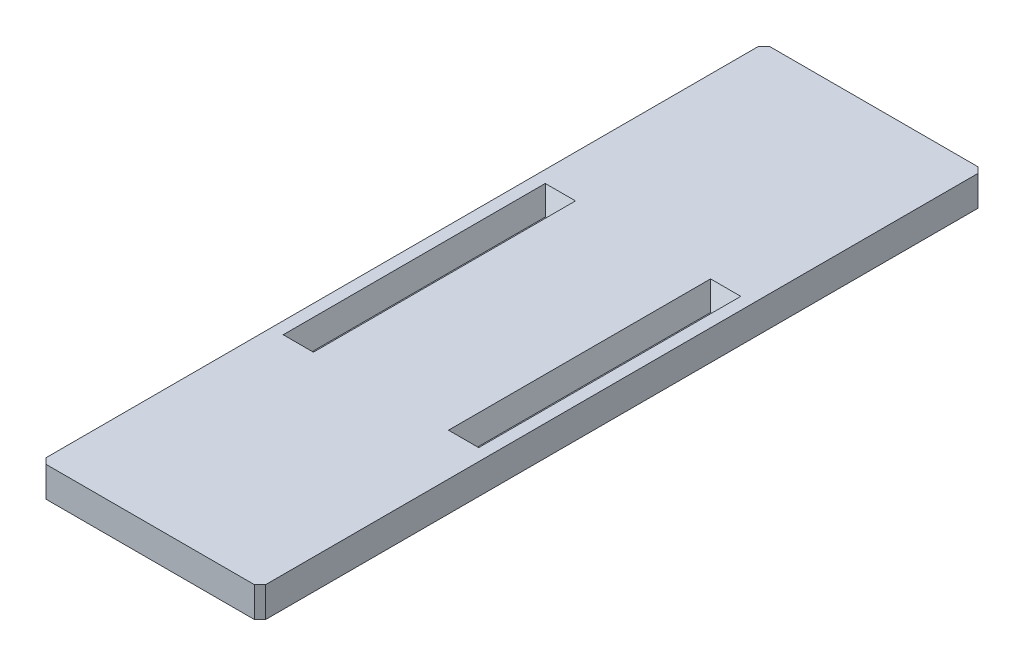
ISO-10303-21;
HEADER;
FILE_DESCRIPTION(('STEP AP214'),'2;1');
FILE_NAME('part.step','',(''),(''),'','','');
FILE_SCHEMA(('AUTOMOTIVE_DESIGN { 1 0 10303 214 1 1 1 1 }'));
ENDSEC;
DATA;
#1=APPLICATION_CONTEXT('core data for automotive mechanical design processes');
#2=APPLICATION_PROTOCOL_DEFINITION('international standard','automotive_design',2000,#1);
#3=PRODUCT_CONTEXT('',#1,'mechanical');
#4=PRODUCT('Part','Part','',(#3));
#5=PRODUCT_RELATED_PRODUCT_CATEGORY('part','',(#4));
#6=PRODUCT_DEFINITION_FORMATION('','',#4);
#7=PRODUCT_DEFINITION_CONTEXT('part definition',#1,'design');
#8=PRODUCT_DEFINITION('design','',#6,#7);
#9=PRODUCT_DEFINITION_SHAPE('','',#8);
#10=(LENGTH_UNIT() NAMED_UNIT(*) SI_UNIT(.MILLI.,.METRE.));
#11=(NAMED_UNIT(*) PLANE_ANGLE_UNIT() SI_UNIT($,.RADIAN.));
#12=(NAMED_UNIT(*) SI_UNIT($,.STERADIAN.) SOLID_ANGLE_UNIT());
#13=UNCERTAINTY_MEASURE_WITH_UNIT(LENGTH_MEASURE(1.E-05),#10,'distance_accuracy_value','');
#14=(GEOMETRIC_REPRESENTATION_CONTEXT(3) GLOBAL_UNCERTAINTY_ASSIGNED_CONTEXT((#13)) GLOBAL_UNIT_ASSIGNED_CONTEXT((#10,
#11,#12)) REPRESENTATION_CONTEXT('',''));
#15=CARTESIAN_POINT('',(0.,0.,0.));
#16=DIRECTION('',(0.,0.,1.));
#17=DIRECTION('',(1.,0.,0.));
#18=AXIS2_PLACEMENT_3D('',#15,#16,#17);
#19=CARTESIAN_POINT('',(0.,1.5,0.));
#20=DIRECTION('',(0.,1.,0.));
#21=DIRECTION('',(0.,0.,1.));
#22=AXIS2_PLACEMENT_3D('',#19,#20,#21);
#23=PLANE('',#22);
#24=DIRECTION('',(0.,0.,-1.));
#25=VECTOR('',#24,1.);
#26=CARTESIAN_POINT('',(10.5,1.5,11.65));
#27=LINE('',#26,#25);
#28=CARTESIAN_POINT('',(10.5,1.5,24.65));
#29=VERTEX_POINT('',#28);
#30=CARTESIAN_POINT('',(10.5,1.5,11.65));
#31=VERTEX_POINT('',#30);
#32=EDGE_CURVE('E187',#29,#31,#27,.T.);
#33=ORIENTED_EDGE('',*,*,#32,.F.);
#34=DIRECTION('',(1.,0.,0.));
#35=VECTOR('',#34,1.);
#36=CARTESIAN_POINT('',(10.5,1.5,24.65));
#37=LINE('',#36,#35);
#38=CARTESIAN_POINT('',(9.00000000000001,1.5,24.65));
#39=VERTEX_POINT('',#38);
#40=EDGE_CURVE('E238',#39,#29,#37,.T.);
#41=ORIENTED_EDGE('',*,*,#40,.F.);
#42=DIRECTION('',(0.,0.,1.));
#43=VECTOR('',#42,1.);
#44=CARTESIAN_POINT('',(9.00000000000001,1.5,11.65));
#45=LINE('',#44,#43);
#46=CARTESIAN_POINT('',(9.00000000000001,1.5,11.65));
#47=VERTEX_POINT('',#46);
#48=EDGE_CURVE('E235',#47,#39,#45,.T.);
#49=ORIENTED_EDGE('',*,*,#48,.F.);
#50=DIRECTION('',(-1.,0.,0.));
#51=VECTOR('',#50,1.);
#52=CARTESIAN_POINT('',(10.5,1.5,11.65));
#53=LINE('',#52,#51);
#54=EDGE_CURVE('E232',#31,#47,#53,.T.);
#55=ORIENTED_EDGE('',*,*,#54,.F.);
#56=EDGE_LOOP('',(#33,#41,#49,#55));
#57=FACE_BOUND('',#56,.T.);
#58=DIRECTION('',(0.,0.,1.));
#59=VECTOR('',#58,1.);
#60=CARTESIAN_POINT('',(0.800000000000003,1.5,11.65));
#61=LINE('',#60,#59);
#62=CARTESIAN_POINT('',(0.800000000000003,1.5,11.65));
#63=VERTEX_POINT('',#62);
#64=CARTESIAN_POINT('',(0.800000000000003,1.5,24.65));
#65=VERTEX_POINT('',#64);
#66=EDGE_CURVE('E197',#63,#65,#61,.T.);
#67=ORIENTED_EDGE('',*,*,#66,.F.);
#68=DIRECTION('',(-1.,0.,0.));
#69=VECTOR('',#68,1.);
#70=CARTESIAN_POINT('',(0.800000000000003,1.5,11.65));
#71=LINE('',#70,#69);
#72=CARTESIAN_POINT('',(2.3,1.5,11.65));
#73=VERTEX_POINT('',#72);
#74=EDGE_CURVE('E206',#73,#63,#71,.T.);
#75=ORIENTED_EDGE('',*,*,#74,.F.);
#76=DIRECTION('',(0.,0.,-1.));
#77=VECTOR('',#76,1.);
#78=CARTESIAN_POINT('',(2.3,1.5,11.65));
#79=LINE('',#78,#77);
#80=CARTESIAN_POINT('',(2.3,1.5,24.65));
#81=VERTEX_POINT('',#80);
#82=EDGE_CURVE('E203',#81,#73,#79,.T.);
#83=ORIENTED_EDGE('',*,*,#82,.F.);
#84=DIRECTION('',(1.,0.,0.));
#85=VECTOR('',#84,1.);
#86=CARTESIAN_POINT('',(0.800000000000003,1.5,24.65));
#87=LINE('',#86,#85);
#88=EDGE_CURVE('E199',#65,#81,#87,.T.);
#89=ORIENTED_EDGE('',*,*,#88,.F.);
#90=EDGE_LOOP('',(#67,#75,#83,#89));
#91=FACE_BOUND('',#90,.T.);
#92=DIRECTION('',(-1.,0.,0.));
#93=VECTOR('',#92,1.);
#94=CARTESIAN_POINT('',(10.8171572875254,1.5,0.2));
#95=LINE('',#94,#93);
#96=CARTESIAN_POINT('',(10.8171572875254,1.5,0.2));
#97=VERTEX_POINT('',#96);
#98=CARTESIAN_POINT('',(0.48284271247462,1.5,0.2));
#99=VERTEX_POINT('',#98);
#100=EDGE_CURVE('E183',#97,#99,#95,.T.);
#101=ORIENTED_EDGE('',*,*,#100,.T.);
#102=DIRECTION('',(-0.707106781186548,0.,0.707106781186548));
#103=VECTOR('',#102,1.);
#104=CARTESIAN_POINT('',(0.48284271247462,1.5,0.2));
#105=LINE('',#104,#103);
#106=CARTESIAN_POINT('',(0.2,1.5,0.48284271247462));
#107=VERTEX_POINT('',#106);
#108=EDGE_CURVE('E172',#99,#107,#105,.T.);
#109=ORIENTED_EDGE('',*,*,#108,.T.);
#110=DIRECTION('',(0.,0.,1.));
#111=VECTOR('',#110,1.);
#112=CARTESIAN_POINT('',(0.2,1.5,0.48284271247462));
#113=LINE('',#112,#111);
#114=CARTESIAN_POINT('',(0.2,1.5,35.8171572875254));
#115=VERTEX_POINT('',#114);
#116=EDGE_CURVE('E170',#107,#115,#113,.T.);
#117=ORIENTED_EDGE('',*,*,#116,.T.);
#118=DIRECTION('',(0.707106781186547,0.,0.707106781186548));
#119=VECTOR('',#118,1.);
#120=CARTESIAN_POINT('',(0.2,1.5,35.8171572875254));
#121=LINE('',#120,#119);
#122=CARTESIAN_POINT('',(0.482842712474612,1.5,36.1));
#123=VERTEX_POINT('',#122);
#124=EDGE_CURVE('E52',#115,#123,#121,.T.);
#125=ORIENTED_EDGE('',*,*,#124,.T.);
#126=DIRECTION('',(1.,0.,0.));
#127=VECTOR('',#126,1.);
#128=CARTESIAN_POINT('',(0.482842712474612,1.5,36.1));
#129=LINE('',#128,#127);
#130=CARTESIAN_POINT('',(10.8171572875254,1.5,36.1));
#131=VERTEX_POINT('',#130);
#132=EDGE_CURVE('E159',#123,#131,#129,.T.);
#133=ORIENTED_EDGE('',*,*,#132,.T.);
#134=DIRECTION('',(0.707106781186545,0.,-0.70710678118655));
#135=VECTOR('',#134,1.);
#136=CARTESIAN_POINT('',(10.8171572875254,1.5,36.1));
#137=LINE('',#136,#135);
#138=CARTESIAN_POINT('',(11.1,1.5,35.8171572875254));
#139=VERTEX_POINT('',#138);
#140=EDGE_CURVE('E165',#131,#139,#137,.T.);
#141=ORIENTED_EDGE('',*,*,#140,.T.);
#142=DIRECTION('',(0.,0.,-1.));
#143=VECTOR('',#142,1.);
#144=CARTESIAN_POINT('',(11.1,1.5,35.8171572875254));
#145=LINE('',#144,#143);
#146=CARTESIAN_POINT('',(11.1,1.5,0.482842712474624));
#147=VERTEX_POINT('',#146);
#148=EDGE_CURVE('E177',#139,#147,#145,.T.);
#149=ORIENTED_EDGE('',*,*,#148,.T.);
#150=DIRECTION('',(-0.707106781186544,0.,-0.707106781186551));
#151=VECTOR('',#150,1.);
#152=CARTESIAN_POINT('',(11.1,1.5,0.482842712474624));
#153=LINE('',#152,#151);
#154=EDGE_CURVE('E180',#147,#97,#153,.T.);
#155=ORIENTED_EDGE('',*,*,#154,.T.);
#156=EDGE_LOOP('',(#101,#109,#117,#125,#133,#141,#149,#155));
#157=FACE_BOUND('',#156,.T.);
#158=ADVANCED_FACE('F37',(#57,#91,#157),#23,.T.);
#159=CARTESIAN_POINT('',(10.5,1.5,11.65));
#160=DIRECTION('',(0.913545457642601,-0.4067366430758,0.));
#161=DIRECTION('',(0.4067366430758,0.913545457642601,0.));
#162=AXIS2_PLACEMENT_3D('',#159,#160,#161);
#163=PLANE('',#162);
#164=ORIENTED_EDGE('',*,*,#32,.T.);
#165=DIRECTION('',(0.376763938507217,0.846225660968196,-0.376763938507217));
#166=VECTOR('',#165,1.);
#167=CARTESIAN_POINT('',(10.5,1.5,11.65));
#168=LINE('',#167,#166);
#169=CARTESIAN_POINT('',(10.0547713146915,0.5,12.0952286853085));
#170=VERTEX_POINT('',#169);
#171=EDGE_CURVE('E244',#170,#31,#168,.T.);
#172=ORIENTED_EDGE('',*,*,#171,.F.);
#173=DIRECTION('',(0.,0.,-1.));
#174=VECTOR('',#173,1.);
#175=CARTESIAN_POINT('',(10.0547713146915,0.5,11.65));
#176=LINE('',#175,#174);
#177=CARTESIAN_POINT('',(10.0547713146915,0.5,24.2047713146915));
#178=VERTEX_POINT('',#177);
#179=EDGE_CURVE('E241',#178,#170,#176,.T.);
#180=ORIENTED_EDGE('',*,*,#179,.F.);
#181=DIRECTION('',(0.376763938507217,0.846225660968196,0.376763938507217));
#182=VECTOR('',#181,1.);
#183=CARTESIAN_POINT('',(10.5,1.5,24.65));
#184=LINE('',#183,#182);
#185=EDGE_CURVE('E200',#178,#29,#184,.T.);
#186=ORIENTED_EDGE('',*,*,#185,.T.);
#187=EDGE_LOOP('',(#164,#172,#180,#186));
#188=FACE_BOUND('',#187,.T.);
#189=ADVANCED_FACE('F305',(#188),#163,.F.);
#190=CARTESIAN_POINT('',(10.5,1.5,24.65));
#191=DIRECTION('',(0.,-0.4067366430758,0.913545457642601));
#192=DIRECTION('',(0.,-0.913545457642601,-0.4067366430758));
#193=AXIS2_PLACEMENT_3D('',#190,#191,#192);
#194=PLANE('',#193);
#195=ORIENTED_EDGE('',*,*,#40,.T.);
#196=ORIENTED_EDGE('',*,*,#185,.F.);
#197=DIRECTION('',(1.,0.,0.));
#198=VECTOR('',#197,1.);
#199=CARTESIAN_POINT('',(10.5,0.5,24.2047713146915));
#200=LINE('',#199,#198);
#201=CARTESIAN_POINT('',(9.44522868530854,0.5,24.2047713146915));
#202=VERTEX_POINT('',#201);
#203=EDGE_CURVE('E248',#202,#178,#200,.T.);
#204=ORIENTED_EDGE('',*,*,#203,.F.);
#205=DIRECTION('',(-0.376763938507217,0.846225660968196,0.376763938507217));
#206=VECTOR('',#205,1.);
#207=CARTESIAN_POINT('',(10.8453638496731,-2.64475506759926,22.8046361503269));
#208=LINE('',#207,#206);
#209=EDGE_CURVE('E243',#202,#39,#208,.T.);
#210=ORIENTED_EDGE('',*,*,#209,.T.);
#211=EDGE_LOOP('',(#195,#196,#204,#210));
#212=FACE_BOUND('',#211,.T.);
#213=ADVANCED_FACE('F310',(#212),#194,.F.);
#214=CARTESIAN_POINT('',(9.00000000000001,1.5,11.65));
#215=DIRECTION('',(-0.913545457642601,-0.4067366430758,0.));
#216=DIRECTION('',(0.4067366430758,-0.913545457642601,0.));
#217=AXIS2_PLACEMENT_3D('',#214,#215,#216);
#218=PLANE('',#217);
#219=ORIENTED_EDGE('',*,*,#48,.T.);
#220=ORIENTED_EDGE('',*,*,#209,.F.);
#221=DIRECTION('',(0.,0.,1.));
#222=VECTOR('',#221,1.);
#223=CARTESIAN_POINT('',(9.44522868530854,0.5,11.65));
#224=LINE('',#223,#222);
#225=CARTESIAN_POINT('',(9.44522868530854,0.5,12.0952286853085));
#226=VERTEX_POINT('',#225);
#227=EDGE_CURVE('E256',#226,#202,#224,.T.);
#228=ORIENTED_EDGE('',*,*,#227,.F.);
#229=DIRECTION('',(-0.376763938507217,0.846225660968196,-0.376763938507217));
#230=VECTOR('',#229,1.);
#231=CARTESIAN_POINT('',(9.21292659803921,1.02175903066162,11.8629265980392));
#232=LINE('',#231,#230);
#233=EDGE_CURVE('E247',#226,#47,#232,.T.);
#234=ORIENTED_EDGE('',*,*,#233,.T.);
#235=EDGE_LOOP('',(#219,#220,#228,#234));
#236=FACE_BOUND('',#235,.T.);
#237=ADVANCED_FACE('F318',(#236),#218,.F.);
#238=CARTESIAN_POINT('',(10.5,1.5,11.65));
#239=DIRECTION('',(0.,-0.4067366430758,-0.913545457642601));
#240=DIRECTION('',(0.,0.913545457642601,-0.4067366430758));
#241=AXIS2_PLACEMENT_3D('',#238,#239,#240);
#242=PLANE('',#241);
#243=ORIENTED_EDGE('',*,*,#54,.T.);
#244=ORIENTED_EDGE('',*,*,#233,.F.);
#245=DIRECTION('',(-1.,0.,0.));
#246=VECTOR('',#245,1.);
#247=CARTESIAN_POINT('',(10.5,0.5,12.0952286853085));
#248=LINE('',#247,#246);
#249=EDGE_CURVE('E253',#170,#226,#248,.T.);
#250=ORIENTED_EDGE('',*,*,#249,.F.);
#251=ORIENTED_EDGE('',*,*,#171,.T.);
#252=EDGE_LOOP('',(#243,#244,#250,#251));
#253=FACE_BOUND('',#252,.T.);
#254=ADVANCED_FACE('F322',(#253),#242,.F.);
#255=CARTESIAN_POINT('',(0.,0.5,0.));
#256=DIRECTION('',(0.,-1.,0.));
#257=DIRECTION('',(0.,0.,-1.));
#258=AXIS2_PLACEMENT_3D('',#255,#256,#257);
#259=PLANE('',#258);
#260=ORIENTED_EDGE('',*,*,#179,.T.);
#261=ORIENTED_EDGE('',*,*,#249,.T.);
#262=ORIENTED_EDGE('',*,*,#227,.T.);
#263=ORIENTED_EDGE('',*,*,#203,.T.);
#264=EDGE_LOOP('',(#260,#261,#262,#263));
#265=FACE_BOUND('',#264,.T.);
#266=ADVANCED_FACE('F325',(#265),#259,.F.);
#267=CARTESIAN_POINT('',(0.800000000000003,1.5,11.65));
#268=DIRECTION('',(-0.913545457642601,-0.4067366430758,0.));
#269=DIRECTION('',(0.4067366430758,-0.913545457642601,0.));
#270=AXIS2_PLACEMENT_3D('',#267,#268,#269);
#271=PLANE('',#270);
#272=ORIENTED_EDGE('',*,*,#66,.T.);
#273=DIRECTION('',(-0.376763938507217,0.846225660968196,0.376763938507217));
#274=VECTOR('',#273,1.);
#275=CARTESIAN_POINT('',(2.64536384967311,-2.64475506759926,22.8046361503269));
#276=LINE('',#275,#274);
#277=CARTESIAN_POINT('',(1.24522868530854,0.5,24.2047713146915));
#278=VERTEX_POINT('',#277);
#279=EDGE_CURVE('E214',#278,#65,#276,.T.);
#280=ORIENTED_EDGE('',*,*,#279,.F.);
#281=DIRECTION('',(0.,0.,1.));
#282=VECTOR('',#281,1.);
#283=CARTESIAN_POINT('',(1.24522868530854,0.5,0.));
#284=LINE('',#283,#282);
#285=CARTESIAN_POINT('',(1.24522868530854,0.5,12.0952286853085));
#286=VERTEX_POINT('',#285);
#287=EDGE_CURVE('E209',#286,#278,#284,.T.);
#288=ORIENTED_EDGE('',*,*,#287,.F.);
#289=DIRECTION('',(-0.376763938507217,0.846225660968196,-0.376763938507217));
#290=VECTOR('',#289,1.);
#291=CARTESIAN_POINT('',(0.800000000000003,1.5,11.65));
#292=LINE('',#291,#290);
#293=EDGE_CURVE('E210',#286,#63,#292,.T.);
#294=ORIENTED_EDGE('',*,*,#293,.T.);
#295=EDGE_LOOP('',(#272,#280,#288,#294));
#296=FACE_BOUND('',#295,.T.);
#297=ADVANCED_FACE('F330',(#296),#271,.F.);
#298=CARTESIAN_POINT('',(0.800000000000003,1.5,11.65));
#299=DIRECTION('',(0.,-0.4067366430758,-0.913545457642601));
#300=DIRECTION('',(0.,0.913545457642601,-0.4067366430758));
#301=AXIS2_PLACEMENT_3D('',#298,#299,#300);
#302=PLANE('',#301);
#303=ORIENTED_EDGE('',*,*,#74,.T.);
#304=ORIENTED_EDGE('',*,*,#293,.F.);
#305=DIRECTION('',(-1.,0.,0.));
#306=VECTOR('',#305,1.);
#307=CARTESIAN_POINT('',(0.,0.5,12.0952286853085));
#308=LINE('',#307,#306);
#309=CARTESIAN_POINT('',(1.85477131469147,0.5,12.0952286853085));
#310=VERTEX_POINT('',#309);
#311=EDGE_CURVE('E218',#310,#286,#308,.T.);
#312=ORIENTED_EDGE('',*,*,#311,.F.);
#313=DIRECTION('',(0.376763938507217,0.846225660968196,-0.376763938507217));
#314=VECTOR('',#313,1.);
#315=CARTESIAN_POINT('',(2.3,1.5,11.65));
#316=LINE('',#315,#314);
#317=EDGE_CURVE('E213',#310,#73,#316,.T.);
#318=ORIENTED_EDGE('',*,*,#317,.T.);
#319=EDGE_LOOP('',(#303,#304,#312,#318));
#320=FACE_BOUND('',#319,.T.);
#321=ADVANCED_FACE('F332',(#320),#302,.F.);
#322=CARTESIAN_POINT('',(2.3,1.5,11.65));
#323=DIRECTION('',(0.913545457642601,-0.4067366430758,0.));
#324=DIRECTION('',(0.4067366430758,0.913545457642601,0.));
#325=AXIS2_PLACEMENT_3D('',#322,#323,#324);
#326=PLANE('',#325);
#327=ORIENTED_EDGE('',*,*,#82,.T.);
#328=ORIENTED_EDGE('',*,*,#317,.F.);
#329=DIRECTION('',(0.,0.,-1.));
#330=VECTOR('',#329,1.);
#331=CARTESIAN_POINT('',(1.85477131469147,0.5,0.));
#332=LINE('',#331,#330);
#333=CARTESIAN_POINT('',(1.85477131469147,0.5,24.2047713146915));
#334=VERTEX_POINT('',#333);
#335=EDGE_CURVE('E226',#334,#310,#332,.T.);
#336=ORIENTED_EDGE('',*,*,#335,.F.);
#337=DIRECTION('',(0.376763938507217,0.846225660968196,0.376763938507217));
#338=VECTOR('',#337,1.);
#339=CARTESIAN_POINT('',(2.0870734019608,1.02175903066162,24.4370734019608));
#340=LINE('',#339,#338);
#341=EDGE_CURVE('E217',#334,#81,#340,.T.);
#342=ORIENTED_EDGE('',*,*,#341,.T.);
#343=EDGE_LOOP('',(#327,#328,#336,#342));
#344=FACE_BOUND('',#343,.T.);
#345=ADVANCED_FACE('F335',(#344),#326,.F.);
#346=CARTESIAN_POINT('',(0.800000000000003,1.5,24.65));
#347=DIRECTION('',(0.,-0.4067366430758,0.913545457642601));
#348=DIRECTION('',(0.,-0.913545457642601,-0.4067366430758));
#349=AXIS2_PLACEMENT_3D('',#346,#347,#348);
#350=PLANE('',#349);
#351=ORIENTED_EDGE('',*,*,#88,.T.);
#352=ORIENTED_EDGE('',*,*,#341,.F.);
#353=DIRECTION('',(1.,0.,0.));
#354=VECTOR('',#353,1.);
#355=CARTESIAN_POINT('',(0.,0.5,24.2047713146915));
#356=LINE('',#355,#354);
#357=EDGE_CURVE('E223',#278,#334,#356,.T.);
#358=ORIENTED_EDGE('',*,*,#357,.F.);
#359=ORIENTED_EDGE('',*,*,#279,.T.);
#360=EDGE_LOOP('',(#351,#352,#358,#359));
#361=FACE_BOUND('',#360,.T.);
#362=ADVANCED_FACE('F339',(#361),#350,.F.);
#363=CARTESIAN_POINT('',(0.,0.5,0.));
#364=DIRECTION('',(0.,1.,0.));
#365=DIRECTION('',(0.,0.,1.));
#366=AXIS2_PLACEMENT_3D('',#363,#364,#365);
#367=PLANE('',#366);
#368=ORIENTED_EDGE('',*,*,#287,.T.);
#369=ORIENTED_EDGE('',*,*,#357,.T.);
#370=ORIENTED_EDGE('',*,*,#335,.T.);
#371=ORIENTED_EDGE('',*,*,#311,.T.);
#372=EDGE_LOOP('',(#368,#369,#370,#371));
#373=FACE_BOUND('',#372,.T.);
#374=ADVANCED_FACE('F343',(#373),#367,.T.);
#375=CARTESIAN_POINT('',(0.48284271247462,-8.5,0.2));
#376=DIRECTION('',(-0.707106781186548,0.,-0.707106781186548));
#377=DIRECTION('',(-0.707106781186548,0.,0.707106781186548));
#378=AXIS2_PLACEMENT_3D('',#375,#376,#377);
#379=PLANE('',#378);
#380=DIRECTION('',(-0.707106781186548,0.,0.707106781186548));
#381=VECTOR('',#380,1.);
#382=CARTESIAN_POINT('',(0.34142135623731,0.,0.34142135623731));
#383=LINE('',#382,#381);
#384=CARTESIAN_POINT('',(0.48284271247462,0.,0.2));
#385=VERTEX_POINT('',#384);
#386=CARTESIAN_POINT('',(0.2,0.,0.48284271247462));
#387=VERTEX_POINT('',#386);
#388=EDGE_CURVE('E11',#385,#387,#383,.T.);
#389=ORIENTED_EDGE('',*,*,#388,.T.);
#390=DIRECTION('',(0.,1.,0.));
#391=VECTOR('',#390,1.);
#392=CARTESIAN_POINT('',(0.2,-8.5,0.48284271247462));
#393=LINE('',#392,#391);
#394=EDGE_CURVE('E60',#387,#107,#393,.T.);
#395=ORIENTED_EDGE('',*,*,#394,.T.);
#396=ORIENTED_EDGE('',*,*,#108,.F.);
#397=DIRECTION('',(0.,1.,0.));
#398=VECTOR('',#397,1.);
#399=CARTESIAN_POINT('',(0.48284271247462,-8.5,0.2));
#400=LINE('',#399,#398);
#401=EDGE_CURVE('E185',#385,#99,#400,.T.);
#402=ORIENTED_EDGE('',*,*,#401,.F.);
#403=EDGE_LOOP('',(#389,#395,#396,#402));
#404=FACE_BOUND('',#403,.T.);
#405=ADVANCED_FACE('F281',(#404),#379,.T.);
#406=CARTESIAN_POINT('',(10.8171572875254,-8.5,0.2));
#407=DIRECTION('',(0.,0.,-1.));
#408=DIRECTION('',(-1.,0.,0.));
#409=AXIS2_PLACEMENT_3D('',#406,#407,#408);
#410=PLANE('',#409);
#411=DIRECTION('',(-1.,0.,0.));
#412=VECTOR('',#411,1.);
#413=CARTESIAN_POINT('',(0.,0.,0.2));
#414=LINE('',#413,#412);
#415=CARTESIAN_POINT('',(10.8171572875254,0.,0.2));
#416=VERTEX_POINT('',#415);
#417=EDGE_CURVE('E45',#416,#385,#414,.T.);
#418=ORIENTED_EDGE('',*,*,#417,.T.);
#419=ORIENTED_EDGE('',*,*,#401,.T.);
#420=ORIENTED_EDGE('',*,*,#100,.F.);
#421=DIRECTION('',(0.,1.,0.));
#422=VECTOR('',#421,1.);
#423=CARTESIAN_POINT('',(10.8171572875254,-8.5,0.2));
#424=LINE('',#423,#422);
#425=EDGE_CURVE('E188',#416,#97,#424,.T.);
#426=ORIENTED_EDGE('',*,*,#425,.F.);
#427=EDGE_LOOP('',(#418,#419,#420,#426));
#428=FACE_BOUND('',#427,.T.);
#429=ADVANCED_FACE('F274',(#428),#410,.T.);
#430=CARTESIAN_POINT('',(11.1,-8.5,0.482842712474624));
#431=DIRECTION('',(0.707106781186551,0.,-0.707106781186544));
#432=DIRECTION('',(-0.707106781186544,0.,-0.707106781186551));
#433=AXIS2_PLACEMENT_3D('',#430,#431,#432);
#434=PLANE('',#433);
#435=DIRECTION('',(-0.707106781186544,0.,-0.707106781186551));
#436=VECTOR('',#435,1.);
#437=CARTESIAN_POINT('',(5.30857864376274,0.,-5.30857864376269));
#438=LINE('',#437,#436);
#439=CARTESIAN_POINT('',(11.1,0.,0.482842712474624));
#440=VERTEX_POINT('',#439);
#441=EDGE_CURVE('E269',#440,#416,#438,.T.);
#442=ORIENTED_EDGE('',*,*,#441,.T.);
#443=ORIENTED_EDGE('',*,*,#425,.T.);
#444=ORIENTED_EDGE('',*,*,#154,.F.);
#445=DIRECTION('',(0.,1.,0.));
#446=VECTOR('',#445,1.);
#447=CARTESIAN_POINT('',(11.1,-8.5,0.482842712474624));
#448=LINE('',#447,#446);
#449=EDGE_CURVE('E190',#440,#147,#448,.T.);
#450=ORIENTED_EDGE('',*,*,#449,.F.);
#451=EDGE_LOOP('',(#442,#443,#444,#450));
#452=FACE_BOUND('',#451,.T.);
#453=ADVANCED_FACE('F288',(#452),#434,.T.);
#454=CARTESIAN_POINT('',(11.1,-8.5,35.8171572875254));
#455=DIRECTION('',(1.,0.,0.));
#456=DIRECTION('',(0.,0.,-1.));
#457=AXIS2_PLACEMENT_3D('',#454,#455,#456);
#458=PLANE('',#457);
#459=DIRECTION('',(0.,0.,-1.));
#460=VECTOR('',#459,1.);
#461=CARTESIAN_POINT('',(11.1,0.,0.));
#462=LINE('',#461,#460);
#463=CARTESIAN_POINT('',(11.1,0.,35.8171572875254));
#464=VERTEX_POINT('',#463);
#465=EDGE_CURVE('E267',#464,#440,#462,.T.);
#466=ORIENTED_EDGE('',*,*,#465,.T.);
#467=ORIENTED_EDGE('',*,*,#449,.T.);
#468=ORIENTED_EDGE('',*,*,#148,.F.);
#469=DIRECTION('',(0.,1.,0.));
#470=VECTOR('',#469,1.);
#471=CARTESIAN_POINT('',(11.1,-8.5,35.8171572875254));
#472=LINE('',#471,#470);
#473=EDGE_CURVE('E192',#464,#139,#472,.T.);
#474=ORIENTED_EDGE('',*,*,#473,.F.);
#475=EDGE_LOOP('',(#466,#467,#468,#474));
#476=FACE_BOUND('',#475,.T.);
#477=ADVANCED_FACE('F293',(#476),#458,.T.);
#478=CARTESIAN_POINT('',(10.8171572875254,-8.5,36.1));
#479=DIRECTION('',(0.70710678118655,0.,0.707106781186545));
#480=DIRECTION('',(0.707106781186545,0.,-0.70710678118655));
#481=AXIS2_PLACEMENT_3D('',#478,#479,#480);
#482=PLANE('',#481);
#483=DIRECTION('',(0.707106781186545,0.,-0.70710678118655));
#484=VECTOR('',#483,1.);
#485=CARTESIAN_POINT('',(23.4585786437627,0.,23.4585786437626));
#486=LINE('',#485,#484);
#487=CARTESIAN_POINT('',(10.8171572875254,0.,36.1));
#488=VERTEX_POINT('',#487);
#489=EDGE_CURVE('E265',#488,#464,#486,.T.);
#490=ORIENTED_EDGE('',*,*,#489,.T.);
#491=ORIENTED_EDGE('',*,*,#473,.T.);
#492=ORIENTED_EDGE('',*,*,#140,.F.);
#493=DIRECTION('',(0.,1.,0.));
#494=VECTOR('',#493,1.);
#495=CARTESIAN_POINT('',(10.8171572875254,-8.5,36.1));
#496=LINE('',#495,#494);
#497=EDGE_CURVE('E155',#488,#131,#496,.T.);
#498=ORIENTED_EDGE('',*,*,#497,.F.);
#499=EDGE_LOOP('',(#490,#491,#492,#498));
#500=FACE_BOUND('',#499,.T.);
#501=ADVANCED_FACE('F295',(#500),#482,.T.);
#502=CARTESIAN_POINT('',(0.482842712474612,-8.5,36.1));
#503=DIRECTION('',(0.,0.,1.));
#504=DIRECTION('',(1.,0.,0.));
#505=AXIS2_PLACEMENT_3D('',#502,#503,#504);
#506=PLANE('',#505);
#507=DIRECTION('',(1.,0.,0.));
#508=VECTOR('',#507,1.);
#509=CARTESIAN_POINT('',(0.,0.,36.1));
#510=LINE('',#509,#508);
#511=CARTESIAN_POINT('',(0.482842712474612,0.,36.1));
#512=VERTEX_POINT('',#511);
#513=EDGE_CURVE('E263',#512,#488,#510,.T.);
#514=ORIENTED_EDGE('',*,*,#513,.T.);
#515=ORIENTED_EDGE('',*,*,#497,.T.);
#516=ORIENTED_EDGE('',*,*,#132,.F.);
#517=DIRECTION('',(0.,1.,0.));
#518=VECTOR('',#517,1.);
#519=CARTESIAN_POINT('',(0.482842712474612,-8.5,36.1));
#520=LINE('',#519,#518);
#521=EDGE_CURVE('E148',#512,#123,#520,.T.);
#522=ORIENTED_EDGE('',*,*,#521,.F.);
#523=EDGE_LOOP('',(#514,#515,#516,#522));
#524=FACE_BOUND('',#523,.T.);
#525=ADVANCED_FACE('F160',(#524),#506,.T.);
#526=CARTESIAN_POINT('',(0.2,-8.5,35.8171572875254));
#527=DIRECTION('',(-0.707106781186548,0.,0.707106781186547));
#528=DIRECTION('',(0.707106781186547,0.,0.707106781186548));
#529=AXIS2_PLACEMENT_3D('',#526,#527,#528);
#530=PLANE('',#529);
#531=DIRECTION('',(0.707106781186547,0.,0.707106781186548));
#532=VECTOR('',#531,1.);
#533=CARTESIAN_POINT('',(-17.8085786437627,0.,17.8085786437627));
#534=LINE('',#533,#532);
#535=CARTESIAN_POINT('',(0.2,0.,35.8171572875254));
#536=VERTEX_POINT('',#535);
#537=EDGE_CURVE('E152',#536,#512,#534,.T.);
#538=ORIENTED_EDGE('',*,*,#537,.T.);
#539=ORIENTED_EDGE('',*,*,#521,.T.);
#540=ORIENTED_EDGE('',*,*,#124,.F.);
#541=DIRECTION('',(0.,1.,0.));
#542=VECTOR('',#541,1.);
#543=CARTESIAN_POINT('',(0.2,-8.5,35.8171572875254));
#544=LINE('',#543,#542);
#545=EDGE_CURVE('E156',#536,#115,#544,.T.);
#546=ORIENTED_EDGE('',*,*,#545,.F.);
#547=EDGE_LOOP('',(#538,#539,#540,#546));
#548=FACE_BOUND('',#547,.T.);
#549=ADVANCED_FACE('F150',(#548),#530,.T.);
#550=CARTESIAN_POINT('',(0.2,-8.5,0.48284271247462));
#551=DIRECTION('',(-1.,0.,0.));
#552=DIRECTION('',(0.,0.,1.));
#553=AXIS2_PLACEMENT_3D('',#550,#551,#552);
#554=PLANE('',#553);
#555=DIRECTION('',(0.,0.,1.));
#556=VECTOR('',#555,1.);
#557=CARTESIAN_POINT('',(0.2,0.,0.));
#558=LINE('',#557,#556);
#559=EDGE_CURVE('E212',#387,#536,#558,.T.);
#560=ORIENTED_EDGE('',*,*,#559,.T.);
#561=ORIENTED_EDGE('',*,*,#545,.T.);
#562=ORIENTED_EDGE('',*,*,#116,.F.);
#563=ORIENTED_EDGE('',*,*,#394,.F.);
#564=EDGE_LOOP('',(#560,#561,#562,#563));
#565=FACE_BOUND('',#564,.T.);
#566=ADVANCED_FACE('F283',(#565),#554,.T.);
#567=CARTESIAN_POINT('',(0.,0.,0.));
#568=DIRECTION('',(0.,1.,0.));
#569=DIRECTION('',(0.,0.,1.));
#570=AXIS2_PLACEMENT_3D('',#567,#568,#569);
#571=PLANE('',#570);
#572=ORIENTED_EDGE('',*,*,#388,.F.);
#573=ORIENTED_EDGE('',*,*,#417,.F.);
#574=ORIENTED_EDGE('',*,*,#441,.F.);
#575=ORIENTED_EDGE('',*,*,#465,.F.);
#576=ORIENTED_EDGE('',*,*,#489,.F.);
#577=ORIENTED_EDGE('',*,*,#513,.F.);
#578=ORIENTED_EDGE('',*,*,#537,.F.);
#579=ORIENTED_EDGE('',*,*,#559,.F.);
#580=EDGE_LOOP('',(#572,#573,#574,#575,#576,#577,#578,#579));
#581=FACE_BOUND('',#580,.T.);
#582=ADVANCED_FACE('F39',(#581),#571,.F.);
#583=CLOSED_SHELL('',(#158,#189,#213,#237,#254,#266,#297,#321,#345,#362,#374,#405,#429,#453,
#477,#501,#525,#549,#566,#582));
#584=MANIFOLD_SOLID_BREP('B2',#583);
#585=ADVANCED_BREP_SHAPE_REPRESENTATION('',(#18,#584),#14);
#586=SHAPE_DEFINITION_REPRESENTATION(#9,#585);
ENDSEC;
END-ISO-10303-21;
